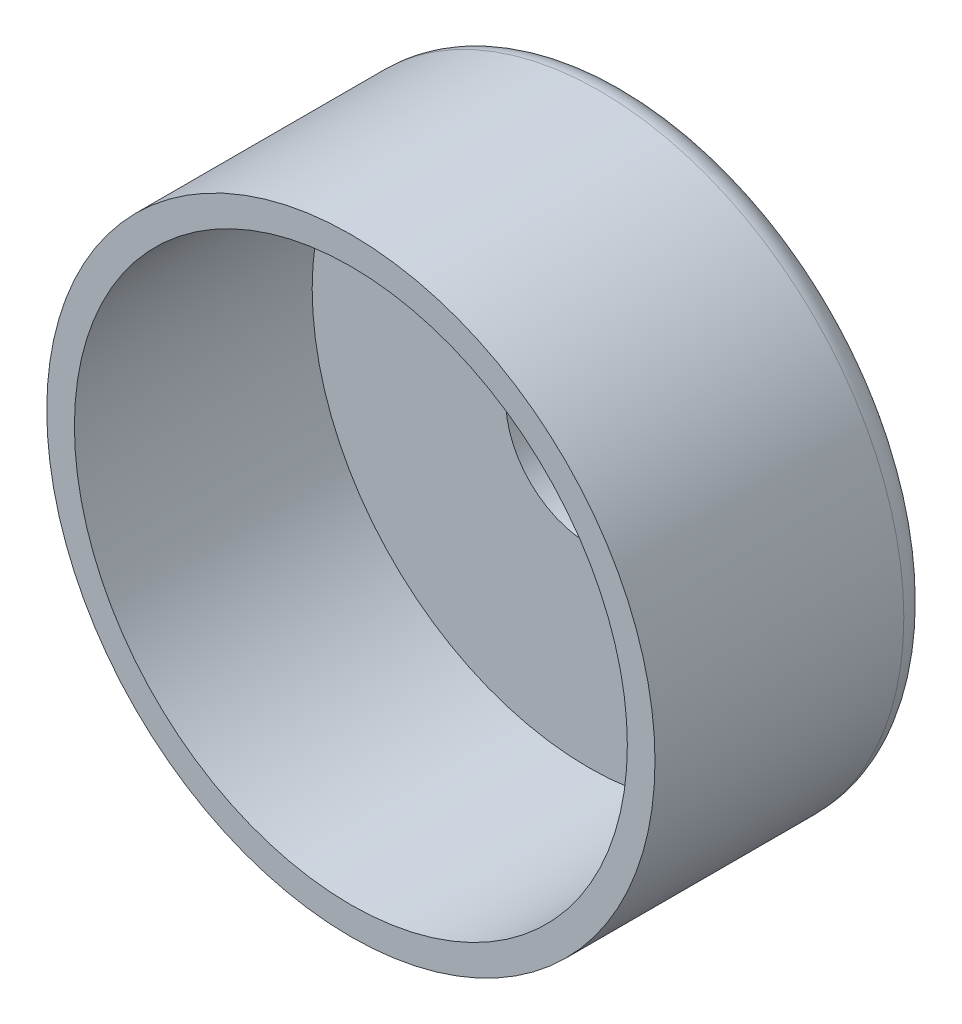
ISO-10303-21;
HEADER;
FILE_DESCRIPTION(('STEP AP214'),'2;1');
FILE_NAME('part.step','',(''),(''),'','','');
FILE_SCHEMA(('AUTOMOTIVE_DESIGN { 1 0 10303 214 1 1 1 1 }'));
ENDSEC;
DATA;
#1=APPLICATION_CONTEXT('core data for automotive mechanical design processes');
#2=APPLICATION_PROTOCOL_DEFINITION('international standard','automotive_design',2000,#1);
#3=PRODUCT_CONTEXT('',#1,'mechanical');
#4=PRODUCT('Part','Part','',(#3));
#5=PRODUCT_RELATED_PRODUCT_CATEGORY('part','',(#4));
#6=PRODUCT_DEFINITION_FORMATION('','',#4);
#7=PRODUCT_DEFINITION_CONTEXT('part definition',#1,'design');
#8=PRODUCT_DEFINITION('design','',#6,#7);
#9=PRODUCT_DEFINITION_SHAPE('','',#8);
#10=(LENGTH_UNIT() NAMED_UNIT(*) SI_UNIT(.MILLI.,.METRE.));
#11=(NAMED_UNIT(*) PLANE_ANGLE_UNIT() SI_UNIT($,.RADIAN.));
#12=(NAMED_UNIT(*) SI_UNIT($,.STERADIAN.) SOLID_ANGLE_UNIT());
#13=UNCERTAINTY_MEASURE_WITH_UNIT(LENGTH_MEASURE(1.E-05),#10,'distance_accuracy_value','');
#14=(GEOMETRIC_REPRESENTATION_CONTEXT(3) GLOBAL_UNCERTAINTY_ASSIGNED_CONTEXT((#13)) GLOBAL_UNIT_ASSIGNED_CONTEXT((#10,
#11,#12)) REPRESENTATION_CONTEXT('',''));
#15=CARTESIAN_POINT('',(0.,0.,0.));
#16=DIRECTION('',(0.,0.,1.));
#17=DIRECTION('',(1.,0.,0.));
#18=AXIS2_PLACEMENT_3D('',#15,#16,#17);
#19=CARTESIAN_POINT('',(0.,0.,6.));
#20=DIRECTION('',(0.,0.,1.));
#21=DIRECTION('',(1.,0.,0.));
#22=AXIS2_PLACEMENT_3D('',#19,#20,#21);
#23=PLANE('',#22);
#24=CARTESIAN_POINT('',(-31.0733874234416,73.7186855148184,6.));
#25=DIRECTION('',(0.,0.,1.));
#26=DIRECTION('',(1.,0.,0.));
#27=AXIS2_PLACEMENT_3D('',#24,#25,#26);
#28=CIRCLE('',#27,6.69999999999999);
#29=CARTESIAN_POINT('',(-24.3733874234416,73.7186855148184,6.));
#30=VERTEX_POINT('',#29);
#31=EDGE_CURVE('E10',#30,#30,#28,.F.);
#32=ORIENTED_EDGE('',*,*,#31,.F.);
#33=EDGE_LOOP('',(#32));
#34=FACE_BOUND('',#33,.T.);
#35=CARTESIAN_POINT('',(-31.0733874234416,73.7186855148184,6.));
#36=DIRECTION('',(0.,0.,1.));
#37=DIRECTION('',(1.,0.,0.));
#38=AXIS2_PLACEMENT_3D('',#35,#36,#37);
#39=CIRCLE('',#38,3.);
#40=CARTESIAN_POINT('',(-28.0733874234416,73.7186855148184,6.));
#41=VERTEX_POINT('',#40);
#42=EDGE_CURVE('E66',#41,#41,#39,.T.);
#43=ORIENTED_EDGE('',*,*,#42,.F.);
#44=EDGE_LOOP('',(#43));
#45=FACE_BOUND('',#44,.T.);
#46=ADVANCED_FACE('F39',(#34,#45),#23,.T.);
#47=CARTESIAN_POINT('',(51.3297609085104,61.3616789623228,6.));
#48=DIRECTION('',(0.,0.,-1.));
#49=DIRECTION('',(-1.,0.,0.));
#50=AXIS2_PLACEMENT_3D('',#47,#48,#49);
#51=CYLINDRICAL_SURFACE('',#50,7.);
#52=CARTESIAN_POINT('',(51.3297609085104,61.3616789623228,0.));
#53=DIRECTION('',(0.,0.,1.));
#54=DIRECTION('',(1.,0.,0.));
#55=AXIS2_PLACEMENT_3D('',#52,#53,#54);
#56=CIRCLE('',#55,7.);
#57=CARTESIAN_POINT('',(58.3297609085104,61.3616789623228,0.));
#58=VERTEX_POINT('',#57);
#59=EDGE_CURVE('E67',#58,#58,#56,.T.);
#60=ORIENTED_EDGE('',*,*,#59,.F.);
#61=EDGE_LOOP('',(#60));
#62=FACE_BOUND('',#61,.T.);
#63=CARTESIAN_POINT('',(51.3297609085104,61.3616789623228,14.));
#64=DIRECTION('',(0.,0.,1.));
#65=DIRECTION('',(1.,0.,0.));
#66=AXIS2_PLACEMENT_3D('',#63,#64,#65);
#67=CIRCLE('',#66,7.);
#68=CARTESIAN_POINT('',(58.3297609085104,61.3616789623228,14.));
#69=VERTEX_POINT('',#68);
#70=EDGE_CURVE('E179',#69,#69,#67,.T.);
#71=ORIENTED_EDGE('',*,*,#70,.T.);
#72=EDGE_LOOP('',(#71));
#73=FACE_BOUND('',#72,.T.);
#74=ADVANCED_FACE('F114',(#62,#73),#51,.F.);
#75=CARTESIAN_POINT('',(-49.0057477497345,63.2331929249931,6.));
#76=DIRECTION('',(0.,0.,-1.));
#77=DIRECTION('',(-1.,0.,0.));
#78=AXIS2_PLACEMENT_3D('',#75,#76,#77);
#79=CYLINDRICAL_SURFACE('',#78,2.25);
#80=CARTESIAN_POINT('',(-49.0057477497345,63.2331929249931,0.));
#81=DIRECTION('',(0.,0.,1.));
#82=DIRECTION('',(1.,0.,0.));
#83=AXIS2_PLACEMENT_3D('',#80,#81,#82);
#84=CIRCLE('',#83,2.25);
#85=CARTESIAN_POINT('',(-46.7557477497345,63.2331929249931,0.));
#86=VERTEX_POINT('',#85);
#87=EDGE_CURVE('E79',#86,#86,#84,.T.);
#88=ORIENTED_EDGE('',*,*,#87,.F.);
#89=EDGE_LOOP('',(#88));
#90=FACE_BOUND('',#89,.T.);
#91=CARTESIAN_POINT('',(-49.0057477497345,63.2331929249931,14.));
#92=DIRECTION('',(0.,0.,1.));
#93=DIRECTION('',(1.,0.,0.));
#94=AXIS2_PLACEMENT_3D('',#91,#92,#93);
#95=CIRCLE('',#94,2.25);
#96=CARTESIAN_POINT('',(-46.7557477497345,63.2331929249931,14.));
#97=VERTEX_POINT('',#96);
#98=EDGE_CURVE('E59',#97,#97,#95,.T.);
#99=ORIENTED_EDGE('',*,*,#98,.T.);
#100=EDGE_LOOP('',(#99));
#101=FACE_BOUND('',#100,.T.);
#102=ADVANCED_FACE('F121',(#90,#101),#79,.F.);
#103=CARTESIAN_POINT('',(30.8823910564116,73.798901906728,6.));
#104=DIRECTION('',(0.,0.,-1.));
#105=DIRECTION('',(-1.,0.,0.));
#106=AXIS2_PLACEMENT_3D('',#103,#104,#105);
#107=CYLINDRICAL_SURFACE('',#106,6.90000000000001);
#108=CARTESIAN_POINT('',(30.8823910564116,73.798901906728,0.));
#109=DIRECTION('',(0.,0.,1.));
#110=DIRECTION('',(1.,0.,0.));
#111=AXIS2_PLACEMENT_3D('',#108,#109,#110);
#112=CIRCLE('',#111,6.90000000000001);
#113=CARTESIAN_POINT('',(37.7823910564116,73.798901906728,0.));
#114=VERTEX_POINT('',#113);
#115=EDGE_CURVE('E76',#114,#114,#112,.T.);
#116=ORIENTED_EDGE('',*,*,#115,.F.);
#117=EDGE_LOOP('',(#116));
#118=FACE_BOUND('',#117,.T.);
#119=CARTESIAN_POINT('',(30.8823910564116,73.798901906728,14.));
#120=DIRECTION('',(0.,0.,1.));
#121=DIRECTION('',(1.,0.,0.));
#122=AXIS2_PLACEMENT_3D('',#119,#120,#121);
#123=CIRCLE('',#122,6.90000000000001);
#124=CARTESIAN_POINT('',(37.7823910564116,73.798901906728,14.));
#125=VERTEX_POINT('',#124);
#126=EDGE_CURVE('E176',#125,#125,#123,.T.);
#127=ORIENTED_EDGE('',*,*,#126,.T.);
#128=EDGE_LOOP('',(#127));
#129=FACE_BOUND('',#128,.T.);
#130=ADVANCED_FACE('F152',(#118,#129),#107,.F.);
#131=CARTESIAN_POINT('',(-31.0733874234416,73.7186855148184,6.));
#132=DIRECTION('',(0.,0.,-1.));
#133=DIRECTION('',(-1.,0.,0.));
#134=AXIS2_PLACEMENT_3D('',#131,#132,#133);
#135=CYLINDRICAL_SURFACE('',#134,3.);
#136=ORIENTED_EDGE('',*,*,#42,.T.);
#137=EDGE_LOOP('',(#136));
#138=FACE_BOUND('',#137,.T.);
#139=CARTESIAN_POINT('',(-31.0733874234416,73.7186855148184,0.));
#140=DIRECTION('',(0.,0.,1.));
#141=DIRECTION('',(1.,0.,0.));
#142=AXIS2_PLACEMENT_3D('',#139,#140,#141);
#143=CIRCLE('',#142,3.);
#144=CARTESIAN_POINT('',(-28.0733874234416,73.7186855148184,0.));
#145=VERTEX_POINT('',#144);
#146=EDGE_CURVE('E73',#145,#145,#143,.T.);
#147=ORIENTED_EDGE('',*,*,#146,.F.);
#148=EDGE_LOOP('',(#147));
#149=FACE_BOUND('',#148,.T.);
#150=ADVANCED_FACE('F134',(#138,#149),#135,.F.);
#151=CARTESIAN_POINT('',(0.,80.,6.));
#152=DIRECTION('',(0.,0.,-1.));
#153=DIRECTION('',(-1.,0.,0.));
#154=AXIS2_PLACEMENT_3D('',#151,#152,#153);
#155=CYLINDRICAL_SURFACE('',#154,10.75);
#156=CARTESIAN_POINT('',(0.,80.,6.));
#157=DIRECTION('',(0.,0.,1.));
#158=DIRECTION('',(1.,0.,0.));
#159=AXIS2_PLACEMENT_3D('',#156,#157,#158);
#160=CIRCLE('',#159,10.75);
#161=CARTESIAN_POINT('',(10.75,80.,6.));
#162=VERTEX_POINT('',#161);
#163=EDGE_CURVE('E63',#162,#162,#160,.T.);
#164=ORIENTED_EDGE('',*,*,#163,.T.);
#165=EDGE_LOOP('',(#164));
#166=FACE_BOUND('',#165,.T.);
#167=CARTESIAN_POINT('',(0.,80.,0.));
#168=DIRECTION('',(0.,0.,1.));
#169=DIRECTION('',(1.,0.,0.));
#170=AXIS2_PLACEMENT_3D('',#167,#168,#169);
#171=CIRCLE('',#170,10.75);
#172=CARTESIAN_POINT('',(10.75,80.,0.));
#173=VERTEX_POINT('',#172);
#174=EDGE_CURVE('E62',#173,#173,#171,.T.);
#175=ORIENTED_EDGE('',*,*,#174,.F.);
#176=EDGE_LOOP('',(#175));
#177=FACE_BOUND('',#176,.T.);
#178=ADVANCED_FACE('F127',(#166,#177),#155,.F.);
#179=CARTESIAN_POINT('',(0.,80.,6.));
#180=DIRECTION('',(0.,0.,1.));
#181=DIRECTION('',(1.,0.,0.));
#182=AXIS2_PLACEMENT_3D('',#179,#180,#181);
#183=CIRCLE('',#182,14.);
#184=CARTESIAN_POINT('',(14.,80.,6.));
#185=VERTEX_POINT('',#184);
#186=EDGE_CURVE('E47',#185,#185,#183,.F.);
#187=ORIENTED_EDGE('',*,*,#186,.F.);
#188=EDGE_LOOP('',(#187));
#189=FACE_BOUND('',#188,.T.);
#190=ORIENTED_EDGE('',*,*,#163,.F.);
#191=EDGE_LOOP('',(#190));
#192=FACE_BOUND('',#191,.T.);
#193=ADVANCED_FACE('F117',(#189,#192),#23,.T.);
#194=CARTESIAN_POINT('',(0.,0.,0.));
#195=DIRECTION('',(0.,0.,1.));
#196=DIRECTION('',(1.,0.,0.));
#197=AXIS2_PLACEMENT_3D('',#194,#195,#196);
#198=PLANE('',#197);
#199=CARTESIAN_POINT('',(0.,0.,0.));
#200=DIRECTION('',(0.,0.,1.));
#201=DIRECTION('',(1.,0.,0.));
#202=AXIS2_PLACEMENT_3D('',#199,#200,#201);
#203=CIRCLE('',#202,30.);
#204=CARTESIAN_POINT('',(30.,0.,0.));
#205=VERTEX_POINT('',#204);
#206=EDGE_CURVE('E182',#205,#205,#203,.T.);
#207=ORIENTED_EDGE('',*,*,#206,.T.);
#208=EDGE_LOOP('',(#207));
#209=FACE_BOUND('',#208,.T.);
#210=ORIENTED_EDGE('',*,*,#174,.T.);
#211=EDGE_LOOP('',(#210));
#212=FACE_BOUND('',#211,.T.);
#213=CARTESIAN_POINT('',(0.,0.,0.));
#214=DIRECTION('',(0.,0.,1.));
#215=DIRECTION('',(1.,0.,0.));
#216=AXIS2_PLACEMENT_3D('',#213,#214,#215);
#217=CIRCLE('',#216,100.);
#218=CARTESIAN_POINT('',(100.,0.,0.));
#219=VERTEX_POINT('',#218);
#220=EDGE_CURVE('E85',#219,#219,#217,.F.);
#221=ORIENTED_EDGE('',*,*,#220,.T.);
#222=EDGE_LOOP('',(#221));
#223=FACE_BOUND('',#222,.T.);
#224=ORIENTED_EDGE('',*,*,#115,.T.);
#225=EDGE_LOOP('',(#224));
#226=FACE_BOUND('',#225,.T.);
#227=ORIENTED_EDGE('',*,*,#87,.T.);
#228=EDGE_LOOP('',(#227));
#229=FACE_BOUND('',#228,.T.);
#230=ORIENTED_EDGE('',*,*,#59,.T.);
#231=EDGE_LOOP('',(#230));
#232=FACE_BOUND('',#231,.T.);
#233=ORIENTED_EDGE('',*,*,#146,.T.);
#234=EDGE_LOOP('',(#233));
#235=FACE_BOUND('',#234,.T.);
#236=ADVANCED_FACE('F98',(#209,#212,#223,#226,#229,#232,#235),#198,.F.);
#237=CARTESIAN_POINT('',(0.,0.,100.));
#238=DIRECTION('',(0.,0.,-1.));
#239=DIRECTION('',(-1.,0.,0.));
#240=AXIS2_PLACEMENT_3D('',#237,#238,#239);
#241=CYLINDRICAL_SURFACE('',#240,100.);
#242=CARTESIAN_POINT('',(0.,0.,14.));
#243=DIRECTION('',(0.,0.,1.));
#244=DIRECTION('',(1.,0.,0.));
#245=AXIS2_PLACEMENT_3D('',#242,#243,#244);
#246=CIRCLE('',#245,100.);
#247=CARTESIAN_POINT('',(100.,0.,14.));
#248=VERTEX_POINT('',#247);
#249=EDGE_CURVE('E43',#248,#248,#246,.T.);
#250=ORIENTED_EDGE('',*,*,#249,.F.);
#251=EDGE_LOOP('',(#250));
#252=FACE_BOUND('',#251,.T.);
#253=CARTESIAN_POINT('',(0.,0.,100.));
#254=DIRECTION('',(0.,0.,1.));
#255=DIRECTION('',(1.,0.,0.));
#256=AXIS2_PLACEMENT_3D('',#253,#254,#255);
#257=CIRCLE('',#256,100.);
#258=CARTESIAN_POINT('',(100.,0.,100.));
#259=VERTEX_POINT('',#258);
#260=EDGE_CURVE('E55',#259,#259,#257,.T.);
#261=ORIENTED_EDGE('',*,*,#260,.T.);
#262=EDGE_LOOP('',(#261));
#263=FACE_BOUND('',#262,.T.);
#264=ADVANCED_FACE('F94',(#252,#263),#241,.F.);
#265=CARTESIAN_POINT('',(0.,0.,100.));
#266=DIRECTION('',(0.,0.,-1.));
#267=DIRECTION('',(-1.,0.,0.));
#268=AXIS2_PLACEMENT_3D('',#265,#266,#267);
#269=CYLINDRICAL_SURFACE('',#268,110.);
#270=CARTESIAN_POINT('',(0.,0.,9.99999999999999));
#271=DIRECTION('',(0.,0.,1.));
#272=DIRECTION('',(1.,0.,0.));
#273=AXIS2_PLACEMENT_3D('',#270,#271,#272);
#274=CIRCLE('',#273,110.);
#275=CARTESIAN_POINT('',(110.,0.,9.99999999999999));
#276=VERTEX_POINT('',#275);
#277=EDGE_CURVE('E70',#276,#276,#274,.T.);
#278=ORIENTED_EDGE('',*,*,#277,.T.);
#279=EDGE_LOOP('',(#278));
#280=FACE_BOUND('',#279,.T.);
#281=CARTESIAN_POINT('',(0.,0.,100.));
#282=DIRECTION('',(0.,0.,1.));
#283=DIRECTION('',(1.,0.,0.));
#284=AXIS2_PLACEMENT_3D('',#281,#282,#283);
#285=CIRCLE('',#284,110.);
#286=CARTESIAN_POINT('',(110.,0.,100.));
#287=VERTEX_POINT('',#286);
#288=EDGE_CURVE('E58',#287,#287,#285,.T.);
#289=ORIENTED_EDGE('',*,*,#288,.F.);
#290=EDGE_LOOP('',(#289));
#291=FACE_BOUND('',#290,.T.);
#292=ADVANCED_FACE('F97',(#280,#291),#269,.T.);
#293=CARTESIAN_POINT('',(0.,0.,100.));
#294=DIRECTION('',(0.,0.,1.));
#295=DIRECTION('',(1.,0.,0.));
#296=AXIS2_PLACEMENT_3D('',#293,#294,#295);
#297=PLANE('',#296);
#298=ORIENTED_EDGE('',*,*,#260,.F.);
#299=EDGE_LOOP('',(#298));
#300=FACE_BOUND('',#299,.T.);
#301=ORIENTED_EDGE('',*,*,#288,.T.);
#302=EDGE_LOOP('',(#301));
#303=FACE_BOUND('',#302,.T.);
#304=ADVANCED_FACE('F102',(#300,#303),#297,.T.);
#305=CARTESIAN_POINT('',(0.,0.,9.99999999999999));
#306=DIRECTION('',(0.,0.,1.));
#307=DIRECTION('',(1.,0.,0.));
#308=AXIS2_PLACEMENT_3D('',#305,#306,#307);
#309=TOROIDAL_SURFACE('',#308,100.,10.);
#310=ORIENTED_EDGE('',*,*,#220,.F.);
#311=EDGE_LOOP('',(#310));
#312=FACE_BOUND('',#311,.T.);
#313=ORIENTED_EDGE('',*,*,#277,.F.);
#314=EDGE_LOOP('',(#313));
#315=FACE_BOUND('',#314,.T.);
#316=ADVANCED_FACE('F41',(#312,#315),#309,.T.);
#317=CARTESIAN_POINT('',(-31.0733874234416,73.7186855148184,14.));
#318=DIRECTION('',(0.,0.,-1.));
#319=DIRECTION('',(-1.,0.,0.));
#320=AXIS2_PLACEMENT_3D('',#317,#318,#319);
#321=CYLINDRICAL_SURFACE('',#320,6.69999999999999);
#322=ORIENTED_EDGE('',*,*,#31,.T.);
#323=EDGE_LOOP('',(#322));
#324=FACE_BOUND('',#323,.T.);
#325=CARTESIAN_POINT('',(-31.0733874234416,73.7186855148184,14.));
#326=DIRECTION('',(0.,0.,1.));
#327=DIRECTION('',(1.,0.,0.));
#328=AXIS2_PLACEMENT_3D('',#325,#326,#327);
#329=CIRCLE('',#328,6.69999999999999);
#330=CARTESIAN_POINT('',(-24.3733874234416,73.7186855148184,14.));
#331=VERTEX_POINT('',#330);
#332=EDGE_CURVE('E169',#331,#331,#329,.T.);
#333=ORIENTED_EDGE('',*,*,#332,.T.);
#334=EDGE_LOOP('',(#333));
#335=FACE_BOUND('',#334,.T.);
#336=ADVANCED_FACE('F204',(#324,#335),#321,.F.);
#337=CARTESIAN_POINT('',(0.,80.,14.));
#338=DIRECTION('',(0.,0.,-1.));
#339=DIRECTION('',(-1.,0.,0.));
#340=AXIS2_PLACEMENT_3D('',#337,#338,#339);
#341=CYLINDRICAL_SURFACE('',#340,14.);
#342=ORIENTED_EDGE('',*,*,#186,.T.);
#343=EDGE_LOOP('',(#342));
#344=FACE_BOUND('',#343,.T.);
#345=CARTESIAN_POINT('',(0.,80.,14.));
#346=DIRECTION('',(0.,0.,1.));
#347=DIRECTION('',(1.,0.,0.));
#348=AXIS2_PLACEMENT_3D('',#345,#346,#347);
#349=CIRCLE('',#348,14.);
#350=CARTESIAN_POINT('',(14.,80.,14.));
#351=VERTEX_POINT('',#350);
#352=EDGE_CURVE('E171',#351,#351,#349,.T.);
#353=ORIENTED_EDGE('',*,*,#352,.T.);
#354=EDGE_LOOP('',(#353));
#355=FACE_BOUND('',#354,.T.);
#356=ADVANCED_FACE('F194',(#344,#355),#341,.F.);
#357=CARTESIAN_POINT('',(0.,0.,14.));
#358=DIRECTION('',(0.,0.,1.));
#359=DIRECTION('',(1.,0.,0.));
#360=AXIS2_PLACEMENT_3D('',#357,#358,#359);
#361=PLANE('',#360);
#362=CARTESIAN_POINT('',(0.,0.,14.));
#363=DIRECTION('',(0.,0.,1.));
#364=DIRECTION('',(1.,0.,0.));
#365=AXIS2_PLACEMENT_3D('',#362,#363,#364);
#366=CIRCLE('',#365,30.);
#367=CARTESIAN_POINT('',(30.,0.,14.));
#368=VERTEX_POINT('',#367);
#369=EDGE_CURVE('E185',#368,#368,#366,.T.);
#370=ORIENTED_EDGE('',*,*,#369,.F.);
#371=EDGE_LOOP('',(#370));
#372=FACE_BOUND('',#371,.T.);
#373=ORIENTED_EDGE('',*,*,#70,.F.);
#374=EDGE_LOOP('',(#373));
#375=FACE_BOUND('',#374,.T.);
#376=ORIENTED_EDGE('',*,*,#126,.F.);
#377=EDGE_LOOP('',(#376));
#378=FACE_BOUND('',#377,.T.);
#379=ORIENTED_EDGE('',*,*,#352,.F.);
#380=EDGE_LOOP('',(#379));
#381=FACE_BOUND('',#380,.T.);
#382=ORIENTED_EDGE('',*,*,#332,.F.);
#383=EDGE_LOOP('',(#382));
#384=FACE_BOUND('',#383,.T.);
#385=ORIENTED_EDGE('',*,*,#98,.F.);
#386=EDGE_LOOP('',(#385));
#387=FACE_BOUND('',#386,.T.);
#388=ORIENTED_EDGE('',*,*,#249,.T.);
#389=EDGE_LOOP('',(#388));
#390=FACE_BOUND('',#389,.T.);
#391=ADVANCED_FACE('F92',(#372,#375,#378,#381,#384,#387,#390),#361,.T.);
#392=CARTESIAN_POINT('',(0.,0.,-96.));
#393=DIRECTION('',(0.,0.,1.));
#394=DIRECTION('',(1.,0.,0.));
#395=AXIS2_PLACEMENT_3D('',#392,#393,#394);
#396=CYLINDRICAL_SURFACE('',#395,30.);
#397=ORIENTED_EDGE('',*,*,#369,.T.);
#398=EDGE_LOOP('',(#397));
#399=FACE_BOUND('',#398,.T.);
#400=ORIENTED_EDGE('',*,*,#206,.F.);
#401=EDGE_LOOP('',(#400));
#402=FACE_BOUND('',#401,.T.);
#403=ADVANCED_FACE('F189',(#399,#402),#396,.F.);
#404=CLOSED_SHELL('',(#46,#74,#102,#130,#150,#178,#193,#236,#264,#292,#304,#316,#336,#356,#391,#403));
#405=MANIFOLD_SOLID_BREP('B2',#404);
#406=ADVANCED_BREP_SHAPE_REPRESENTATION('',(#18,#405),#14);
#407=SHAPE_DEFINITION_REPRESENTATION(#9,#406);
ENDSEC;
END-ISO-10303-21;
